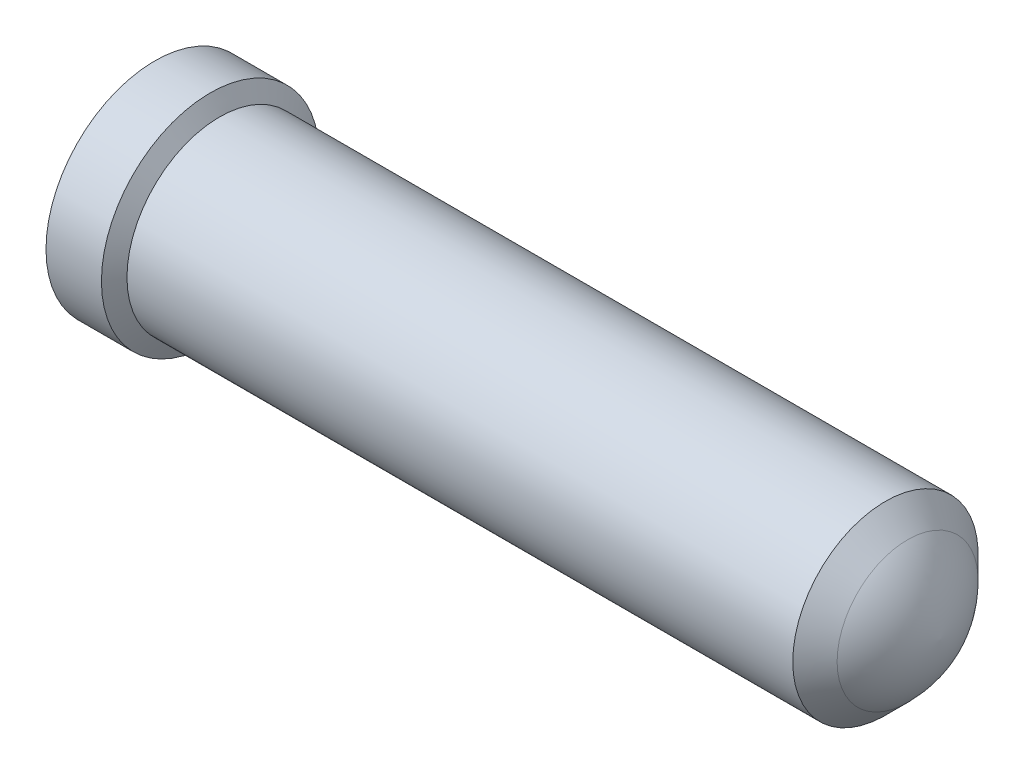
ISO-10303-21;
HEADER;
FILE_DESCRIPTION(('STEP AP214'),'2;1');
FILE_NAME('part.step','',(''),(''),'','','');
FILE_SCHEMA(('AUTOMOTIVE_DESIGN { 1 0 10303 214 1 1 1 1 }'));
ENDSEC;
DATA;
#1=APPLICATION_CONTEXT('core data for automotive mechanical design processes');
#2=APPLICATION_PROTOCOL_DEFINITION('international standard','automotive_design',2000,#1);
#3=PRODUCT_CONTEXT('',#1,'mechanical');
#4=PRODUCT('Part','Part','',(#3));
#5=PRODUCT_RELATED_PRODUCT_CATEGORY('part','',(#4));
#6=PRODUCT_DEFINITION_FORMATION('','',#4);
#7=PRODUCT_DEFINITION_CONTEXT('part definition',#1,'design');
#8=PRODUCT_DEFINITION('design','',#6,#7);
#9=PRODUCT_DEFINITION_SHAPE('','',#8);
#10=(LENGTH_UNIT() NAMED_UNIT(*) SI_UNIT(.MILLI.,.METRE.));
#11=(NAMED_UNIT(*) PLANE_ANGLE_UNIT() SI_UNIT($,.RADIAN.));
#12=(NAMED_UNIT(*) SI_UNIT($,.STERADIAN.) SOLID_ANGLE_UNIT());
#13=UNCERTAINTY_MEASURE_WITH_UNIT(LENGTH_MEASURE(1.E-05),#10,'distance_accuracy_value','');
#14=(GEOMETRIC_REPRESENTATION_CONTEXT(3) GLOBAL_UNCERTAINTY_ASSIGNED_CONTEXT((#13)) GLOBAL_UNIT_ASSIGNED_CONTEXT((#10,
#11,#12)) REPRESENTATION_CONTEXT('',''));
#15=CARTESIAN_POINT('',(0.,0.,0.));
#16=DIRECTION('',(0.,0.,1.));
#17=DIRECTION('',(1.,0.,0.));
#18=AXIS2_PLACEMENT_3D('',#15,#16,#17);
#19=CARTESIAN_POINT('',(3.86240736971013,0.,-0.0451528060534668));
#20=DIRECTION('',(0.,-1.,0.));
#21=DIRECTION('',(0.,0.,1.));
#22=AXIS2_PLACEMENT_3D('',#19,#20,#21);
#23=CIRCLE('',#22,0.635000000000021);
#24=TRIMMED_CURVE('',#23,(PARAMETER_VALUE(-1.49962948747847)),
(PARAMETER_VALUE(1.49962948747847)),.T.,.PARAMETER.);
#25=CARTESIAN_POINT('',(3.86240736971013,0.,0.));
#26=DIRECTION('',(-1.,0.,0.));
#27=AXIS1_PLACEMENT('',#25,#26);
#28=SURFACE_OF_REVOLUTION('',#24,#27);
#29=CARTESIAN_POINT('',(4.3114201757636,0.,0.));
#30=DIRECTION('',(-1.,0.,0.));
#31=DIRECTION('',(0.,0.,1.));
#32=AXIS2_PLACEMENT_3D('',#29,#30,#31);
#33=CIRCLE('',#32,0.403860000000006);
#34=CARTESIAN_POINT('',(4.3114201757636,0.,0.403860000000006));
#35=VERTEX_POINT('',#34);
#36=EDGE_CURVE('E11',#35,#35,#33,.T.);
#37=ORIENTED_EDGE('',*,*,#36,.F.);
#38=EDGE_LOOP('',(#37));
#39=FACE_BOUND('',#38,.T.);
#40=CARTESIAN_POINT('',(4.4958,0.,0.));
#41=VERTEX_POINT('',#40);
#42=VERTEX_LOOP('',#41);
#43=FACE_BOUND('',#42,.T.);
#44=ADVANCED_FACE('F33',(#39,#43),#28,.T.);
#45=CARTESIAN_POINT('',(4.3114201757636,0.,0.));
#46=DIRECTION('',(-1.,0.,0.));
#47=DIRECTION('',(0.,0.,1.));
#48=AXIS2_PLACEMENT_3D('',#45,#46,#47);
#49=CONICAL_SURFACE('',#48,0.403860000000006,0.785398163397448);
#50=CARTESIAN_POINT('',(4.18442017576361,0.,0.));
#51=DIRECTION('',(-1.,0.,0.));
#52=DIRECTION('',(0.,0.,1.));
#53=AXIS2_PLACEMENT_3D('',#50,#51,#52);
#54=CIRCLE('',#53,0.530859999999994);
#55=CARTESIAN_POINT('',(4.18442017576361,0.,0.530859999999994));
#56=VERTEX_POINT('',#55);
#57=EDGE_CURVE('E40',#56,#56,#54,.T.);
#58=ORIENTED_EDGE('',*,*,#57,.F.);
#59=EDGE_LOOP('',(#58));
#60=FACE_BOUND('',#59,.T.);
#61=ORIENTED_EDGE('',*,*,#36,.T.);
#62=EDGE_LOOP('',(#61));
#63=FACE_BOUND('',#62,.T.);
#64=ADVANCED_FACE('F76',(#60,#63),#49,.T.);
#65=CARTESIAN_POINT('',(0.,0.,0.));
#66=DIRECTION('',(-1.,0.,0.));
#67=DIRECTION('',(0.,0.,1.));
#68=AXIS2_PLACEMENT_3D('',#65,#66,#67);
#69=CYLINDRICAL_SURFACE('',#68,0.530859999999994);
#70=CARTESIAN_POINT('',(0.371026143456577,0.,0.));
#71=DIRECTION('',(-1.,0.,0.));
#72=DIRECTION('',(0.,0.,1.));
#73=AXIS2_PLACEMENT_3D('',#70,#71,#72);
#74=CIRCLE('',#73,0.530859999999994);
#75=CARTESIAN_POINT('',(0.371026143456577,0.,0.530859999999994));
#76=VERTEX_POINT('',#75);
#77=EDGE_CURVE('E69',#76,#76,#74,.T.);
#78=ORIENTED_EDGE('',*,*,#77,.F.);
#79=EDGE_LOOP('',(#78));
#80=FACE_BOUND('',#79,.T.);
#81=ORIENTED_EDGE('',*,*,#57,.T.);
#82=EDGE_LOOP('',(#81));
#83=FACE_BOUND('',#82,.T.);
#84=ADVANCED_FACE('F74',(#80,#83),#69,.T.);
#85=CARTESIAN_POINT('',(0.371026143456577,0.,0.));
#86=DIRECTION('',(-1.,0.,0.));
#87=DIRECTION('',(0.,0.,1.));
#88=AXIS2_PLACEMENT_3D('',#85,#86,#87);
#89=CONICAL_SURFACE('',#88,0.530859999999994,1.04719755119674);
#90=CARTESIAN_POINT('',(0.317500000000026,0.,0.));
#91=DIRECTION('',(-1.,0.,0.));
#92=DIRECTION('',(0.,0.,1.));
#93=AXIS2_PLACEMENT_3D('',#90,#91,#92);
#94=CIRCLE('',#93,0.62356999999999);
#95=CARTESIAN_POINT('',(0.317500000000026,0.,0.62356999999999));
#96=VERTEX_POINT('',#95);
#97=EDGE_CURVE('E60',#96,#96,#94,.T.);
#98=ORIENTED_EDGE('',*,*,#97,.F.);
#99=EDGE_LOOP('',(#98));
#100=FACE_BOUND('',#99,.T.);
#101=ORIENTED_EDGE('',*,*,#77,.T.);
#102=EDGE_LOOP('',(#101));
#103=FACE_BOUND('',#102,.T.);
#104=ADVANCED_FACE('F94',(#100,#103),#89,.T.);
#105=CARTESIAN_POINT('',(0.,0.,0.));
#106=DIRECTION('',(-1.,0.,0.));
#107=DIRECTION('',(0.,0.,1.));
#108=AXIS2_PLACEMENT_3D('',#105,#106,#107);
#109=CYLINDRICAL_SURFACE('',#108,0.62356999999999);
#110=CARTESIAN_POINT('',(0.,0.,0.));
#111=DIRECTION('',(-1.,0.,0.));
#112=DIRECTION('',(0.,0.,1.));
#113=AXIS2_PLACEMENT_3D('',#110,#111,#112);
#114=CIRCLE('',#113,0.62356999999999);
#115=CARTESIAN_POINT('',(0.,0.,0.62356999999999));
#116=VERTEX_POINT('',#115);
#117=EDGE_CURVE('E56',#116,#116,#114,.T.);
#118=ORIENTED_EDGE('',*,*,#117,.F.);
#119=EDGE_LOOP('',(#118));
#120=FACE_BOUND('',#119,.T.);
#121=ORIENTED_EDGE('',*,*,#97,.T.);
#122=EDGE_LOOP('',(#121));
#123=FACE_BOUND('',#122,.T.);
#124=ADVANCED_FACE('F102',(#120,#123),#109,.T.);
#125=CARTESIAN_POINT('',(0.,0.,0.));
#126=DIRECTION('',(1.,0.,0.));
#127=DIRECTION('',(0.,0.,-1.));
#128=AXIS2_PLACEMENT_3D('',#125,#126,#127);
#129=PLANE('',#128);
#130=CARTESIAN_POINT('',(0.,0.,0.));
#131=DIRECTION('',(-1.,0.,0.));
#132=DIRECTION('',(0.,0.,1.));
#133=AXIS2_PLACEMENT_3D('',#130,#131,#132);
#134=CIRCLE('',#133,0.546100000000001);
#135=CARTESIAN_POINT('',(0.,0.,0.546100000000001));
#136=VERTEX_POINT('',#135);
#137=EDGE_CURVE('E63',#136,#136,#134,.T.);
#138=ORIENTED_EDGE('',*,*,#137,.F.);
#139=EDGE_LOOP('',(#138));
#140=FACE_BOUND('',#139,.T.);
#141=ORIENTED_EDGE('',*,*,#117,.T.);
#142=EDGE_LOOP('',(#141));
#143=FACE_BOUND('',#142,.T.);
#144=ADVANCED_FACE('F50',(#140,#143),#129,.F.);
#145=CARTESIAN_POINT('',(1.9304,0.,0.));
#146=DIRECTION('',(-1.,0.,0.));
#147=DIRECTION('',(0.,0.,1.));
#148=AXIS2_PLACEMENT_3D('',#145,#146,#147);
#149=CONICAL_SURFACE('',#148,0.457200000000001,1.02974425867666);
#150=CARTESIAN_POINT('',(2.2051134750194,0.,0.));
#151=VERTEX_POINT('',#150);
#152=VERTEX_LOOP('',#151);
#153=FACE_BOUND('',#152,.T.);
#154=CARTESIAN_POINT('',(1.9304,0.,0.));
#155=DIRECTION('',(-1.,0.,0.));
#156=DIRECTION('',(0.,0.,1.));
#157=AXIS2_PLACEMENT_3D('',#154,#155,#156);
#158=CIRCLE('',#157,0.457200000000001);
#159=CARTESIAN_POINT('',(1.9304,0.,0.457200000000001));
#160=VERTEX_POINT('',#159);
#161=EDGE_CURVE('E54',#160,#160,#158,.T.);
#162=ORIENTED_EDGE('',*,*,#161,.T.);
#163=EDGE_LOOP('',(#162));
#164=FACE_BOUND('',#163,.T.);
#165=ADVANCED_FACE('F46',(#153,#164),#149,.F.);
#166=CARTESIAN_POINT('',(0.,0.,0.));
#167=DIRECTION('',(-1.,0.,0.));
#168=DIRECTION('',(0.,0.,1.));
#169=AXIS2_PLACEMENT_3D('',#166,#167,#168);
#170=CYLINDRICAL_SURFACE('',#169,0.457200000000001);
#171=ORIENTED_EDGE('',*,*,#161,.F.);
#172=EDGE_LOOP('',(#171));
#173=FACE_BOUND('',#172,.T.);
#174=CARTESIAN_POINT('',(0.0888999999999998,0.,0.));
#175=DIRECTION('',(-1.,0.,0.));
#176=DIRECTION('',(0.,0.,1.));
#177=AXIS2_PLACEMENT_3D('',#174,#175,#176);
#178=CIRCLE('',#177,0.4572);
#179=CARTESIAN_POINT('',(0.0888999999999998,0.,0.4572));
#180=VERTEX_POINT('',#179);
#181=EDGE_CURVE('E57',#180,#180,#178,.T.);
#182=ORIENTED_EDGE('',*,*,#181,.T.);
#183=EDGE_LOOP('',(#182));
#184=FACE_BOUND('',#183,.T.);
#185=ADVANCED_FACE('F49',(#173,#184),#170,.F.);
#186=CARTESIAN_POINT('',(0.,0.,0.));
#187=DIRECTION('',(-1.,0.,0.));
#188=DIRECTION('',(0.,0.,1.));
#189=AXIS2_PLACEMENT_3D('',#186,#187,#188);
#190=CONICAL_SURFACE('',#189,0.546100000000001,0.785398163397443);
#191=ORIENTED_EDGE('',*,*,#181,.F.);
#192=EDGE_LOOP('',(#191));
#193=FACE_BOUND('',#192,.T.);
#194=ORIENTED_EDGE('',*,*,#137,.T.);
#195=EDGE_LOOP('',(#194));
#196=FACE_BOUND('',#195,.T.);
#197=ADVANCED_FACE('F128',(#193,#196),#190,.F.);
#198=CLOSED_SHELL('',(#44,#64,#84,#104,#124,#144,#165,#185,#197));
#199=MANIFOLD_SOLID_BREP('B2',#198);
#200=ADVANCED_BREP_SHAPE_REPRESENTATION('',(#18,#199),#14);
#201=SHAPE_DEFINITION_REPRESENTATION(#9,#200);
ENDSEC;
END-ISO-10303-21;
